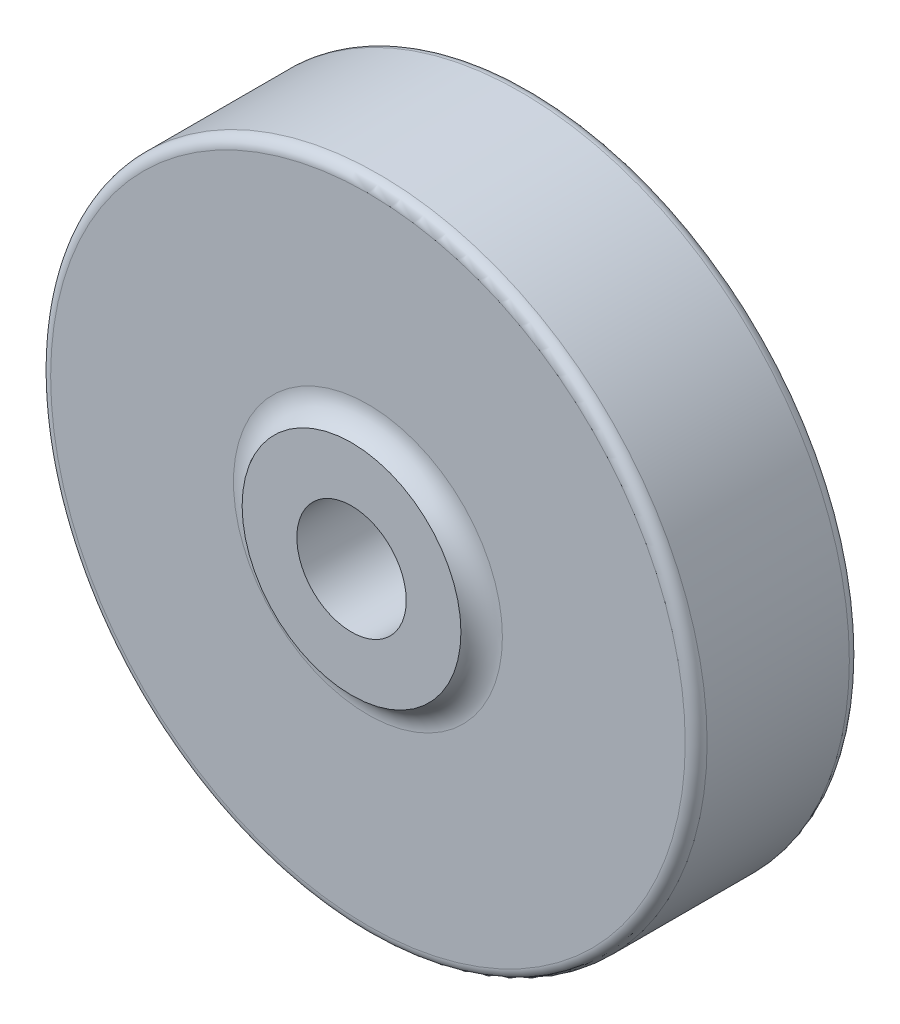
ISO-10303-21;
HEADER;
FILE_DESCRIPTION(('STEP AP214'),'2;1');
FILE_NAME('part.step','',(''),(''),'','','');
FILE_SCHEMA(('AUTOMOTIVE_DESIGN { 1 0 10303 214 1 1 1 1 }'));
ENDSEC;
DATA;
#1=APPLICATION_CONTEXT('core data for automotive mechanical design processes');
#2=APPLICATION_PROTOCOL_DEFINITION('international standard','automotive_design',2000,#1);
#3=PRODUCT_CONTEXT('',#1,'mechanical');
#4=PRODUCT('Part','Part','',(#3));
#5=PRODUCT_RELATED_PRODUCT_CATEGORY('part','',(#4));
#6=PRODUCT_DEFINITION_FORMATION('','',#4);
#7=PRODUCT_DEFINITION_CONTEXT('part definition',#1,'design');
#8=PRODUCT_DEFINITION('design','',#6,#7);
#9=PRODUCT_DEFINITION_SHAPE('','',#8);
#10=(LENGTH_UNIT() NAMED_UNIT(*) SI_UNIT(.MILLI.,.METRE.));
#11=(NAMED_UNIT(*) PLANE_ANGLE_UNIT() SI_UNIT($,.RADIAN.));
#12=(NAMED_UNIT(*) SI_UNIT($,.STERADIAN.) SOLID_ANGLE_UNIT());
#13=UNCERTAINTY_MEASURE_WITH_UNIT(LENGTH_MEASURE(1.E-05),#10,'distance_accuracy_value','');
#14=(GEOMETRIC_REPRESENTATION_CONTEXT(3) GLOBAL_UNCERTAINTY_ASSIGNED_CONTEXT((#13)) GLOBAL_UNIT_ASSIGNED_CONTEXT((#10,
#11,#12)) REPRESENTATION_CONTEXT('',''));
#15=CARTESIAN_POINT('',(0.,0.,0.));
#16=DIRECTION('',(0.,0.,1.));
#17=DIRECTION('',(1.,0.,0.));
#18=AXIS2_PLACEMENT_3D('',#15,#16,#17);
#19=CARTESIAN_POINT('',(0.,0.,30.));
#20=DIRECTION('',(0.,0.,-1.));
#21=DIRECTION('',(-1.,0.,0.));
#22=AXIS2_PLACEMENT_3D('',#19,#20,#21);
#23=CYLINDRICAL_SURFACE('',#22,60.);
#24=CARTESIAN_POINT('',(0.,0.,28.));
#25=DIRECTION('',(0.,0.,1.));
#26=DIRECTION('',(1.,0.,0.));
#27=AXIS2_PLACEMENT_3D('',#24,#25,#26);
#28=CIRCLE('',#27,60.);
#29=CARTESIAN_POINT('',(60.,0.,28.));
#30=VERTEX_POINT('',#29);
#31=EDGE_CURVE('E56',#30,#30,#28,.F.);
#32=ORIENTED_EDGE('',*,*,#31,.T.);
#33=EDGE_LOOP('',(#32));
#34=FACE_BOUND('',#33,.T.);
#35=CARTESIAN_POINT('',(0.,0.,2.));
#36=DIRECTION('',(0.,0.,1.));
#37=DIRECTION('',(1.,0.,0.));
#38=AXIS2_PLACEMENT_3D('',#35,#36,#37);
#39=CIRCLE('',#38,60.);
#40=CARTESIAN_POINT('',(60.,0.,2.));
#41=VERTEX_POINT('',#40);
#42=EDGE_CURVE('E61',#41,#41,#39,.T.);
#43=ORIENTED_EDGE('',*,*,#42,.T.);
#44=EDGE_LOOP('',(#43));
#45=FACE_BOUND('',#44,.T.);
#46=ADVANCED_FACE('F41',(#34,#45),#23,.T.);
#47=CARTESIAN_POINT('',(0.,0.,30.));
#48=DIRECTION('',(0.,0.,1.));
#49=DIRECTION('',(1.,0.,0.));
#50=AXIS2_PLACEMENT_3D('',#47,#48,#49);
#51=PLANE('',#50);
#52=CARTESIAN_POINT('',(0.,0.,30.));
#53=DIRECTION('',(0.,0.,1.));
#54=DIRECTION('',(1.,0.,0.));
#55=AXIS2_PLACEMENT_3D('',#52,#53,#54);
#56=CIRCLE('',#55,24.5825756949558);
#57=CARTESIAN_POINT('',(24.5825756949558,0.,30.));
#58=VERTEX_POINT('',#57);
#59=EDGE_CURVE('E48',#58,#58,#56,.F.);
#60=ORIENTED_EDGE('',*,*,#59,.T.);
#61=EDGE_LOOP('',(#60));
#62=FACE_BOUND('',#61,.T.);
#63=CARTESIAN_POINT('',(0.,0.,30.));
#64=DIRECTION('',(0.,0.,1.));
#65=DIRECTION('',(1.,0.,0.));
#66=AXIS2_PLACEMENT_3D('',#63,#64,#65);
#67=CIRCLE('',#66,58.);
#68=CARTESIAN_POINT('',(58.,0.,30.));
#69=VERTEX_POINT('',#68);
#70=EDGE_CURVE('E64',#69,#69,#67,.T.);
#71=ORIENTED_EDGE('',*,*,#70,.T.);
#72=EDGE_LOOP('',(#71));
#73=FACE_BOUND('',#72,.T.);
#74=ADVANCED_FACE('F96',(#62,#73),#51,.T.);
#75=CARTESIAN_POINT('',(0.,0.,0.));
#76=DIRECTION('',(0.,0.,1.));
#77=DIRECTION('',(1.,0.,0.));
#78=AXIS2_PLACEMENT_3D('',#75,#76,#77);
#79=PLANE('',#78);
#80=CARTESIAN_POINT('',(0.,0.,0.));
#81=DIRECTION('',(0.,0.,1.));
#82=DIRECTION('',(1.,0.,0.));
#83=AXIS2_PLACEMENT_3D('',#80,#81,#82);
#84=CIRCLE('',#83,24.5825756949558);
#85=CARTESIAN_POINT('',(24.5825756949558,0.,0.));
#86=VERTEX_POINT('',#85);
#87=EDGE_CURVE('E10',#86,#86,#84,.T.);
#88=ORIENTED_EDGE('',*,*,#87,.T.);
#89=EDGE_LOOP('',(#88));
#90=FACE_BOUND('',#89,.T.);
#91=CARTESIAN_POINT('',(0.,0.,0.));
#92=DIRECTION('',(0.,0.,1.));
#93=DIRECTION('',(1.,0.,0.));
#94=AXIS2_PLACEMENT_3D('',#91,#92,#93);
#95=CIRCLE('',#94,58.);
#96=CARTESIAN_POINT('',(58.,0.,0.));
#97=VERTEX_POINT('',#96);
#98=EDGE_CURVE('E52',#97,#97,#95,.F.);
#99=ORIENTED_EDGE('',*,*,#98,.T.);
#100=EDGE_LOOP('',(#99));
#101=FACE_BOUND('',#100,.T.);
#102=ADVANCED_FACE('F103',(#90,#101),#79,.F.);
#103=CARTESIAN_POINT('',(0.,0.,28.));
#104=DIRECTION('',(0.,0.,1.));
#105=DIRECTION('',(1.,0.,0.));
#106=AXIS2_PLACEMENT_3D('',#103,#104,#105);
#107=TOROIDAL_SURFACE('',#106,58.,2.);
#108=ORIENTED_EDGE('',*,*,#31,.F.);
#109=EDGE_LOOP('',(#108));
#110=FACE_BOUND('',#109,.T.);
#111=ORIENTED_EDGE('',*,*,#70,.F.);
#112=EDGE_LOOP('',(#111));
#113=FACE_BOUND('',#112,.T.);
#114=ADVANCED_FACE('F108',(#110,#113),#107,.T.);
#115=CARTESIAN_POINT('',(0.,0.,2.));
#116=DIRECTION('',(0.,0.,1.));
#117=DIRECTION('',(1.,0.,0.));
#118=AXIS2_PLACEMENT_3D('',#115,#116,#117);
#119=TOROIDAL_SURFACE('',#118,58.,2.);
#120=ORIENTED_EDGE('',*,*,#98,.F.);
#121=EDGE_LOOP('',(#120));
#122=FACE_BOUND('',#121,.T.);
#123=ORIENTED_EDGE('',*,*,#42,.F.);
#124=EDGE_LOOP('',(#123));
#125=FACE_BOUND('',#124,.T.);
#126=ADVANCED_FACE('F110',(#122,#125),#119,.T.);
#127=CARTESIAN_POINT('',(0.,0.,33.));
#128=DIRECTION('',(0.,0.,1.));
#129=DIRECTION('',(1.,0.,0.));
#130=AXIS2_PLACEMENT_3D('',#127,#128,#129);
#131=PLANE('',#130);
#132=CARTESIAN_POINT('',(0.,0.,33.));
#133=DIRECTION('',(0.,0.,1.));
#134=DIRECTION('',(1.,0.,0.));
#135=AXIS2_PLACEMENT_3D('',#132,#133,#134);
#136=CIRCLE('',#135,10.);
#137=CARTESIAN_POINT('',(10.,0.,33.));
#138=VERTEX_POINT('',#137);
#139=EDGE_CURVE('E70',#138,#138,#136,.T.);
#140=ORIENTED_EDGE('',*,*,#139,.F.);
#141=EDGE_LOOP('',(#140));
#142=FACE_BOUND('',#141,.T.);
#143=CARTESIAN_POINT('',(0.,0.,33.));
#144=DIRECTION('',(0.,0.,1.));
#145=DIRECTION('',(1.,0.,0.));
#146=AXIS2_PLACEMENT_3D('',#143,#144,#145);
#147=CIRCLE('',#146,20.);
#148=CARTESIAN_POINT('',(20.,0.,33.));
#149=VERTEX_POINT('',#148);
#150=EDGE_CURVE('E67',#149,#149,#147,.T.);
#151=ORIENTED_EDGE('',*,*,#150,.T.);
#152=EDGE_LOOP('',(#151));
#153=FACE_BOUND('',#152,.T.);
#154=ADVANCED_FACE('F113',(#142,#153),#131,.T.);
#155=CARTESIAN_POINT('',(0.,0.,0.));
#156=DIRECTION('',(0.,0.,1.));
#157=DIRECTION('',(1.,0.,0.));
#158=AXIS2_PLACEMENT_3D('',#155,#156,#157);
#159=CYLINDRICAL_SURFACE('',#158,10.);
#160=ORIENTED_EDGE('',*,*,#139,.T.);
#161=EDGE_LOOP('',(#160));
#162=FACE_BOUND('',#161,.T.);
#163=CARTESIAN_POINT('',(0.,0.,-3.));
#164=DIRECTION('',(0.,0.,-1.));
#165=DIRECTION('',(-1.,0.,0.));
#166=AXIS2_PLACEMENT_3D('',#163,#164,#165);
#167=CIRCLE('',#166,10.);
#168=CARTESIAN_POINT('',(-10.,0.,-3.));
#169=VERTEX_POINT('',#168);
#170=EDGE_CURVE('E76',#169,#169,#167,.T.);
#171=ORIENTED_EDGE('',*,*,#170,.T.);
#172=EDGE_LOOP('',(#171));
#173=FACE_BOUND('',#172,.T.);
#174=ADVANCED_FACE('F80',(#162,#173),#159,.F.);
#175=CARTESIAN_POINT('',(0.,0.,35.));
#176=DIRECTION('',(0.,0.,1.));
#177=DIRECTION('',(1.,0.,0.));
#178=AXIS2_PLACEMENT_3D('',#175,#176,#177);
#179=TOROIDAL_SURFACE('',#178,24.5825756949558,5.);
#180=ORIENTED_EDGE('',*,*,#59,.F.);
#181=EDGE_LOOP('',(#180));
#182=FACE_BOUND('',#181,.T.);
#183=ORIENTED_EDGE('',*,*,#150,.F.);
#184=EDGE_LOOP('',(#183));
#185=FACE_BOUND('',#184,.T.);
#186=ADVANCED_FACE('F85',(#182,#185),#179,.F.);
#187=CARTESIAN_POINT('',(0.,0.,-3.));
#188=DIRECTION('',(0.,0.,-1.));
#189=DIRECTION('',(-1.,0.,0.));
#190=AXIS2_PLACEMENT_3D('',#187,#188,#189);
#191=PLANE('',#190);
#192=ORIENTED_EDGE('',*,*,#170,.F.);
#193=EDGE_LOOP('',(#192));
#194=FACE_BOUND('',#193,.T.);
#195=CARTESIAN_POINT('',(0.,0.,-3.));
#196=DIRECTION('',(0.,0.,-1.));
#197=DIRECTION('',(-1.,0.,0.));
#198=AXIS2_PLACEMENT_3D('',#195,#196,#197);
#199=CIRCLE('',#198,20.);
#200=CARTESIAN_POINT('',(-20.,0.,-3.));
#201=VERTEX_POINT('',#200);
#202=EDGE_CURVE('E73',#201,#201,#199,.T.);
#203=ORIENTED_EDGE('',*,*,#202,.T.);
#204=EDGE_LOOP('',(#203));
#205=FACE_BOUND('',#204,.T.);
#206=ADVANCED_FACE('F82',(#194,#205),#191,.T.);
#207=CARTESIAN_POINT('',(0.,0.,-5.));
#208=DIRECTION('',(0.,0.,1.));
#209=DIRECTION('',(1.,0.,0.));
#210=AXIS2_PLACEMENT_3D('',#207,#208,#209);
#211=TOROIDAL_SURFACE('',#210,24.5825756949558,5.);
#212=ORIENTED_EDGE('',*,*,#87,.F.);
#213=EDGE_LOOP('',(#212));
#214=FACE_BOUND('',#213,.T.);
#215=ORIENTED_EDGE('',*,*,#202,.F.);
#216=EDGE_LOOP('',(#215));
#217=FACE_BOUND('',#216,.T.);
#218=ADVANCED_FACE('F43',(#214,#217),#211,.F.);
#219=CLOSED_SHELL('',(#46,#74,#102,#114,#126,#154,#174,#186,#206,#218));
#220=MANIFOLD_SOLID_BREP('B2',#219);
#221=ADVANCED_BREP_SHAPE_REPRESENTATION('',(#18,#220),#14);
#222=SHAPE_DEFINITION_REPRESENTATION(#9,#221);
ENDSEC;
END-ISO-10303-21;
